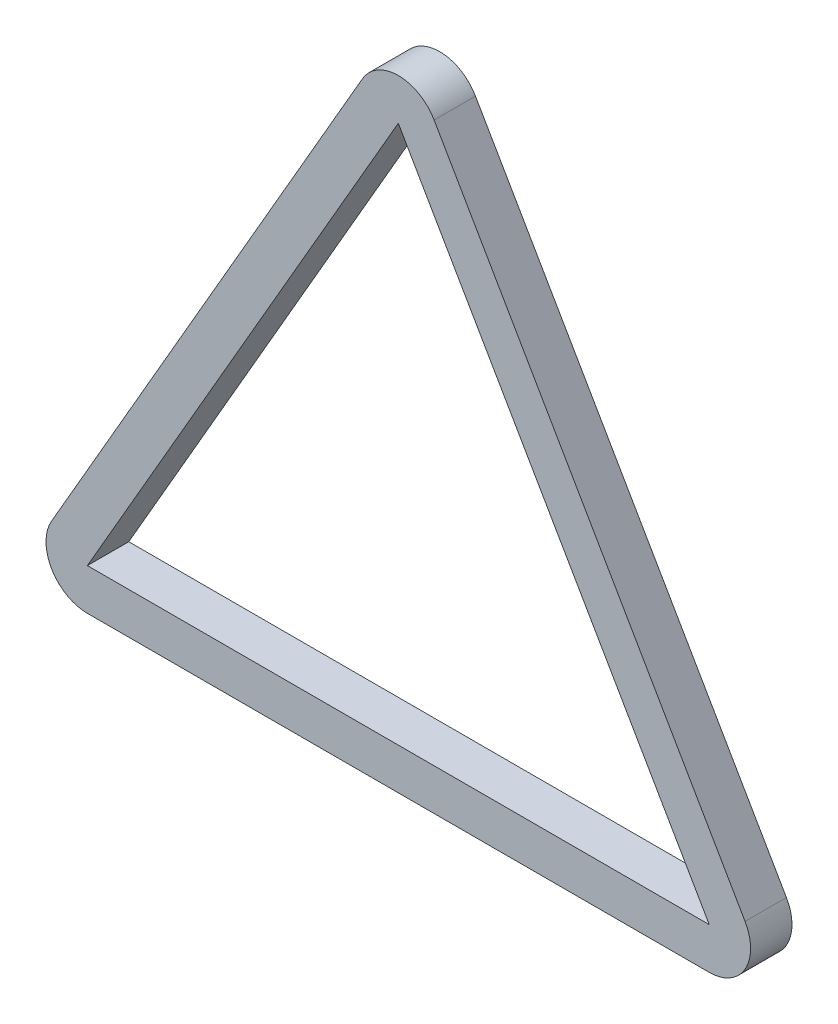
ISO-10303-21;
HEADER;
FILE_DESCRIPTION(('STEP AP214'),'2;1');
FILE_NAME('part.step','',(''),(''),'','','');
FILE_SCHEMA(('AUTOMOTIVE_DESIGN { 1 0 10303 214 1 1 1 1 }'));
ENDSEC;
DATA;
#1=APPLICATION_CONTEXT('core data for automotive mechanical design processes');
#2=APPLICATION_PROTOCOL_DEFINITION('international standard','automotive_design',2000,#1);
#3=PRODUCT_CONTEXT('',#1,'mechanical');
#4=PRODUCT('Part','Part','',(#3));
#5=PRODUCT_RELATED_PRODUCT_CATEGORY('part','',(#4));
#6=PRODUCT_DEFINITION_FORMATION('','',#4);
#7=PRODUCT_DEFINITION_CONTEXT('part definition',#1,'design');
#8=PRODUCT_DEFINITION('design','',#6,#7);
#9=PRODUCT_DEFINITION_SHAPE('','',#8);
#10=(LENGTH_UNIT() NAMED_UNIT(*) SI_UNIT(.MILLI.,.METRE.));
#11=(NAMED_UNIT(*) PLANE_ANGLE_UNIT() SI_UNIT($,.RADIAN.));
#12=(NAMED_UNIT(*) SI_UNIT($,.STERADIAN.) SOLID_ANGLE_UNIT());
#13=UNCERTAINTY_MEASURE_WITH_UNIT(LENGTH_MEASURE(1.E-05),#10,'distance_accuracy_value','');
#14=(GEOMETRIC_REPRESENTATION_CONTEXT(3) GLOBAL_UNCERTAINTY_ASSIGNED_CONTEXT((#13)) GLOBAL_UNIT_ASSIGNED_CONTEXT((#10,
#11,#12)) REPRESENTATION_CONTEXT('',''));
#15=CARTESIAN_POINT('',(0.,0.,0.));
#16=DIRECTION('',(0.,0.,1.));
#17=DIRECTION('',(1.,0.,0.));
#18=AXIS2_PLACEMENT_3D('',#15,#16,#17);
#19=CARTESIAN_POINT('',(0.,0.,20.));
#20=DIRECTION('',(0.,0.,1.));
#21=DIRECTION('',(1.,0.,0.));
#22=AXIS2_PLACEMENT_3D('',#19,#20,#21);
#23=PLANE('',#22);
#24=DIRECTION('',(-0.5,0.866025403784439,0.));
#25=VECTOR('',#24,1.);
#26=CARTESIAN_POINT('',(185.,-140.94634004319,20.));
#27=LINE('',#26,#25);
#28=CARTESIAN_POINT('',(167.679491924311,-110.94634004319,20.));
#29=VERTEX_POINT('',#28);
#30=CARTESIAN_POINT('',(17.3205080756889,149.483059357053,20.));
#31=VERTEX_POINT('',#30);
#32=EDGE_CURVE('E136',#29,#31,#27,.T.);
#33=ORIENTED_EDGE('',*,*,#32,.T.);
#34=CARTESIAN_POINT('',(0.,139.483059357053,20.));
#35=DIRECTION('',(0.,0.,1.));
#36=DIRECTION('',(1.,0.,0.));
#37=AXIS2_PLACEMENT_3D('',#34,#35,#36);
#38=CIRCLE('',#37,20.);
#39=CARTESIAN_POINT('',(-17.3205080756887,149.483059357053,20.));
#40=VERTEX_POINT('',#39);
#41=EDGE_CURVE('E169',#31,#40,#38,.T.);
#42=ORIENTED_EDGE('',*,*,#41,.T.);
#43=DIRECTION('',(-0.5,-0.866025403784439,0.));
#44=VECTOR('',#43,1.);
#45=CARTESIAN_POINT('',(0.,179.483059357053,20.));
#46=LINE('',#45,#44);
#47=CARTESIAN_POINT('',(-167.679491924311,-110.946340043189,20.));
#48=VERTEX_POINT('',#47);
#49=EDGE_CURVE('E139',#40,#48,#46,.T.);
#50=ORIENTED_EDGE('',*,*,#49,.T.);
#51=CARTESIAN_POINT('',(-150.358983848622,-120.94634004319,20.));
#52=DIRECTION('',(0.,0.,1.));
#53=DIRECTION('',(1.,0.,0.));
#54=AXIS2_PLACEMENT_3D('',#51,#52,#53);
#55=CIRCLE('',#54,20.);
#56=CARTESIAN_POINT('',(-150.358983848622,-140.94634004319,20.));
#57=VERTEX_POINT('',#56);
#58=EDGE_CURVE('E52',#48,#57,#55,.T.);
#59=ORIENTED_EDGE('',*,*,#58,.T.);
#60=DIRECTION('',(1.,0.,0.));
#61=VECTOR('',#60,1.);
#62=CARTESIAN_POINT('',(-185.,-140.94634004319,20.));
#63=LINE('',#62,#61);
#64=CARTESIAN_POINT('',(150.358983848622,-140.94634004319,20.));
#65=VERTEX_POINT('',#64);
#66=EDGE_CURVE('E142',#57,#65,#63,.T.);
#67=ORIENTED_EDGE('',*,*,#66,.T.);
#68=CARTESIAN_POINT('',(150.358983848622,-120.94634004319,20.));
#69=DIRECTION('',(0.,0.,1.));
#70=DIRECTION('',(1.,0.,0.));
#71=AXIS2_PLACEMENT_3D('',#68,#69,#70);
#72=CIRCLE('',#71,20.);
#73=EDGE_CURVE('E167',#65,#29,#72,.T.);
#74=ORIENTED_EDGE('',*,*,#73,.T.);
#75=EDGE_LOOP('',(#33,#42,#50,#59,#67,#74));
#76=FACE_BOUND('',#75,.T.);
#77=DIRECTION('',(-0.5,-0.866025403784438,0.));
#78=VECTOR('',#77,1.);
#79=CARTESIAN_POINT('',(0.,139.483059357053,20.));
#80=LINE('',#79,#78);
#81=CARTESIAN_POINT('',(0.,139.483059357053,20.));
#82=VERTEX_POINT('',#81);
#83=CARTESIAN_POINT('',(-150.358983848622,-120.94634004319,20.));
#84=VERTEX_POINT('',#83);
#85=EDGE_CURVE('E114',#82,#84,#80,.T.);
#86=ORIENTED_EDGE('',*,*,#85,.F.);
#87=DIRECTION('',(-0.5,0.866025403784438,0.));
#88=VECTOR('',#87,1.);
#89=CARTESIAN_POINT('',(150.358983848622,-120.94634004319,20.));
#90=LINE('',#89,#88);
#91=CARTESIAN_POINT('',(150.358983848622,-120.94634004319,20.));
#92=VERTEX_POINT('',#91);
#93=EDGE_CURVE('E104',#92,#82,#90,.T.);
#94=ORIENTED_EDGE('',*,*,#93,.F.);
#95=DIRECTION('',(1.,0.,0.));
#96=VECTOR('',#95,1.);
#97=CARTESIAN_POINT('',(-150.358983848622,-120.94634004319,20.));
#98=LINE('',#97,#96);
#99=EDGE_CURVE('E125',#84,#92,#98,.T.);
#100=ORIENTED_EDGE('',*,*,#99,.F.);
#101=EDGE_LOOP('',(#86,#94,#100));
#102=FACE_BOUND('',#101,.T.);
#103=ADVANCED_FACE('F32',(#76,#102),#23,.T.);
#104=CARTESIAN_POINT('',(0.,0.,0.));
#105=DIRECTION('',(0.,0.,1.));
#106=DIRECTION('',(1.,0.,0.));
#107=AXIS2_PLACEMENT_3D('',#104,#105,#106);
#108=PLANE('',#107);
#109=DIRECTION('',(-0.5,-0.866025403784439,0.));
#110=VECTOR('',#109,1.);
#111=CARTESIAN_POINT('',(0.,179.483059357053,0.));
#112=LINE('',#111,#110);
#113=CARTESIAN_POINT('',(-17.3205080756887,149.483059357053,0.));
#114=VERTEX_POINT('',#113);
#115=CARTESIAN_POINT('',(-167.679491924311,-110.946340043189,0.));
#116=VERTEX_POINT('',#115);
#117=EDGE_CURVE('E147',#114,#116,#112,.T.);
#118=ORIENTED_EDGE('',*,*,#117,.F.);
#119=CARTESIAN_POINT('',(0.,139.483059357053,0.));
#120=DIRECTION('',(0.,0.,1.));
#121=DIRECTION('',(1.,0.,0.));
#122=AXIS2_PLACEMENT_3D('',#119,#120,#121);
#123=CIRCLE('',#122,20.);
#124=CARTESIAN_POINT('',(17.3205080756889,149.483059357053,0.));
#125=VERTEX_POINT('',#124);
#126=EDGE_CURVE('E159',#114,#125,#123,.F.);
#127=ORIENTED_EDGE('',*,*,#126,.T.);
#128=DIRECTION('',(-0.5,0.866025403784439,0.));
#129=VECTOR('',#128,1.);
#130=CARTESIAN_POINT('',(185.,-140.94634004319,0.));
#131=LINE('',#130,#129);
#132=CARTESIAN_POINT('',(167.679491924311,-110.94634004319,0.));
#133=VERTEX_POINT('',#132);
#134=EDGE_CURVE('E122',#133,#125,#131,.T.);
#135=ORIENTED_EDGE('',*,*,#134,.F.);
#136=CARTESIAN_POINT('',(150.358983848622,-120.94634004319,0.));
#137=DIRECTION('',(0.,0.,1.));
#138=DIRECTION('',(1.,0.,0.));
#139=AXIS2_PLACEMENT_3D('',#136,#137,#138);
#140=CIRCLE('',#139,20.);
#141=CARTESIAN_POINT('',(150.358983848622,-140.94634004319,0.));
#142=VERTEX_POINT('',#141);
#143=EDGE_CURVE('E157',#133,#142,#140,.F.);
#144=ORIENTED_EDGE('',*,*,#143,.T.);
#145=DIRECTION('',(1.,0.,0.));
#146=VECTOR('',#145,1.);
#147=CARTESIAN_POINT('',(-185.,-140.94634004319,0.));
#148=LINE('',#147,#146);
#149=CARTESIAN_POINT('',(-150.358983848622,-140.94634004319,0.));
#150=VERTEX_POINT('',#149);
#151=EDGE_CURVE('E140',#150,#142,#148,.T.);
#152=ORIENTED_EDGE('',*,*,#151,.F.);
#153=CARTESIAN_POINT('',(-150.358983848622,-120.94634004319,0.));
#154=DIRECTION('',(0.,0.,1.));
#155=DIRECTION('',(1.,0.,0.));
#156=AXIS2_PLACEMENT_3D('',#153,#154,#155);
#157=CIRCLE('',#156,20.);
#158=EDGE_CURVE('E155',#150,#116,#157,.F.);
#159=ORIENTED_EDGE('',*,*,#158,.T.);
#160=EDGE_LOOP('',(#118,#127,#135,#144,#152,#159));
#161=FACE_BOUND('',#160,.T.);
#162=DIRECTION('',(-0.5,0.866025403784438,0.));
#163=VECTOR('',#162,1.);
#164=CARTESIAN_POINT('',(150.358983848622,-120.94634004319,0.));
#165=LINE('',#164,#163);
#166=CARTESIAN_POINT('',(150.358983848622,-120.94634004319,0.));
#167=VERTEX_POINT('',#166);
#168=CARTESIAN_POINT('',(0.,139.483059357053,0.));
#169=VERTEX_POINT('',#168);
#170=EDGE_CURVE('E129',#167,#169,#165,.T.);
#171=ORIENTED_EDGE('',*,*,#170,.T.);
#172=DIRECTION('',(-0.5,-0.866025403784438,0.));
#173=VECTOR('',#172,1.);
#174=CARTESIAN_POINT('',(0.,139.483059357053,0.));
#175=LINE('',#174,#173);
#176=CARTESIAN_POINT('',(-150.358983848622,-120.94634004319,0.));
#177=VERTEX_POINT('',#176);
#178=EDGE_CURVE('E121',#169,#177,#175,.T.);
#179=ORIENTED_EDGE('',*,*,#178,.T.);
#180=DIRECTION('',(1.,0.,0.));
#181=VECTOR('',#180,1.);
#182=CARTESIAN_POINT('',(-150.358983848622,-120.94634004319,0.));
#183=LINE('',#182,#181);
#184=EDGE_CURVE('E115',#177,#167,#183,.T.);
#185=ORIENTED_EDGE('',*,*,#184,.T.);
#186=EDGE_LOOP('',(#171,#179,#185));
#187=FACE_BOUND('',#186,.T.);
#188=ADVANCED_FACE('F177',(#161,#187),#108,.F.);
#189=CARTESIAN_POINT('',(185.,-140.94634004319,20.));
#190=DIRECTION('',(-0.866025403784439,-0.5,0.));
#191=DIRECTION('',(0.5,-0.866025403784439,0.));
#192=AXIS2_PLACEMENT_3D('',#189,#190,#191);
#193=PLANE('',#192);
#194=ORIENTED_EDGE('',*,*,#134,.T.);
#195=DIRECTION('',(0.,0.,-1.));
#196=VECTOR('',#195,1.);
#197=CARTESIAN_POINT('',(17.3205080756888,149.483059357053,20.));
#198=LINE('',#197,#196);
#199=EDGE_CURVE('E164',#125,#31,#198,.F.);
#200=ORIENTED_EDGE('',*,*,#199,.T.);
#201=ORIENTED_EDGE('',*,*,#32,.F.);
#202=DIRECTION('',(0.,0.,-1.));
#203=VECTOR('',#202,1.);
#204=CARTESIAN_POINT('',(167.679491924311,-110.94634004319,20.));
#205=LINE('',#204,#203);
#206=EDGE_CURVE('E161',#29,#133,#205,.T.);
#207=ORIENTED_EDGE('',*,*,#206,.T.);
#208=EDGE_LOOP('',(#194,#200,#201,#207));
#209=FACE_BOUND('',#208,.T.);
#210=ADVANCED_FACE('F186',(#209),#193,.F.);
#211=CARTESIAN_POINT('',(0.,179.483059357053,20.));
#212=DIRECTION('',(0.866025403784439,-0.5,0.));
#213=DIRECTION('',(0.5,0.866025403784439,0.));
#214=AXIS2_PLACEMENT_3D('',#211,#212,#213);
#215=PLANE('',#214);
#216=ORIENTED_EDGE('',*,*,#49,.F.);
#217=DIRECTION('',(0.,0.,-1.));
#218=VECTOR('',#217,1.);
#219=CARTESIAN_POINT('',(-17.3205080756887,149.483059357053,20.));
#220=LINE('',#219,#218);
#221=EDGE_CURVE('E152',#40,#114,#220,.T.);
#222=ORIENTED_EDGE('',*,*,#221,.T.);
#223=ORIENTED_EDGE('',*,*,#117,.T.);
#224=DIRECTION('',(0.,0.,-1.));
#225=VECTOR('',#224,1.);
#226=CARTESIAN_POINT('',(-167.679491924311,-110.94634004319,20.));
#227=LINE('',#226,#225);
#228=EDGE_CURVE('E144',#116,#48,#227,.F.);
#229=ORIENTED_EDGE('',*,*,#228,.T.);
#230=EDGE_LOOP('',(#216,#222,#223,#229));
#231=FACE_BOUND('',#230,.T.);
#232=ADVANCED_FACE('F194',(#231),#215,.F.);
#233=CARTESIAN_POINT('',(-185.,-140.94634004319,20.));
#234=DIRECTION('',(0.,1.,0.));
#235=DIRECTION('',(0.,0.,1.));
#236=AXIS2_PLACEMENT_3D('',#233,#234,#235);
#237=PLANE('',#236);
#238=ORIENTED_EDGE('',*,*,#151,.T.);
#239=DIRECTION('',(0.,0.,-1.));
#240=VECTOR('',#239,1.);
#241=CARTESIAN_POINT('',(150.358983848622,-140.94634004319,20.));
#242=LINE('',#241,#240);
#243=EDGE_CURVE('E11',#142,#65,#242,.F.);
#244=ORIENTED_EDGE('',*,*,#243,.T.);
#245=ORIENTED_EDGE('',*,*,#66,.F.);
#246=DIRECTION('',(0.,0.,-1.));
#247=VECTOR('',#246,1.);
#248=CARTESIAN_POINT('',(-150.358983848622,-140.94634004319,20.));
#249=LINE('',#248,#247);
#250=EDGE_CURVE('E40',#57,#150,#249,.T.);
#251=ORIENTED_EDGE('',*,*,#250,.T.);
#252=EDGE_LOOP('',(#238,#244,#245,#251));
#253=FACE_BOUND('',#252,.T.);
#254=ADVANCED_FACE('F173',(#253),#237,.F.);
#255=CARTESIAN_POINT('',(150.358983848622,-120.94634004319,20.));
#256=DIRECTION('',(-0.866025403784439,-0.5,0.));
#257=DIRECTION('',(0.5,-0.866025403784439,0.));
#258=AXIS2_PLACEMENT_3D('',#255,#256,#257);
#259=PLANE('',#258);
#260=ORIENTED_EDGE('',*,*,#170,.F.);
#261=DIRECTION('',(0.,0.,-1.));
#262=VECTOR('',#261,1.);
#263=CARTESIAN_POINT('',(150.358983848622,-120.94634004319,20.));
#264=LINE('',#263,#262);
#265=EDGE_CURVE('E110',#92,#167,#264,.T.);
#266=ORIENTED_EDGE('',*,*,#265,.F.);
#267=ORIENTED_EDGE('',*,*,#93,.T.);
#268=DIRECTION('',(0.,0.,-1.));
#269=VECTOR('',#268,1.);
#270=CARTESIAN_POINT('',(0.,139.483059357053,20.));
#271=LINE('',#270,#269);
#272=EDGE_CURVE('E107',#82,#169,#271,.T.);
#273=ORIENTED_EDGE('',*,*,#272,.T.);
#274=EDGE_LOOP('',(#260,#266,#267,#273));
#275=FACE_BOUND('',#274,.T.);
#276=ADVANCED_FACE('F106',(#275),#259,.T.);
#277=CARTESIAN_POINT('',(0.,139.483059357053,20.));
#278=DIRECTION('',(0.866025403784439,-0.5,0.));
#279=DIRECTION('',(0.5,0.866025403784439,0.));
#280=AXIS2_PLACEMENT_3D('',#277,#278,#279);
#281=PLANE('',#280);
#282=ORIENTED_EDGE('',*,*,#178,.F.);
#283=ORIENTED_EDGE('',*,*,#272,.F.);
#284=ORIENTED_EDGE('',*,*,#85,.T.);
#285=DIRECTION('',(0.,0.,-1.));
#286=VECTOR('',#285,1.);
#287=CARTESIAN_POINT('',(-150.358983848622,-120.94634004319,20.));
#288=LINE('',#287,#286);
#289=EDGE_CURVE('E123',#84,#177,#288,.T.);
#290=ORIENTED_EDGE('',*,*,#289,.T.);
#291=EDGE_LOOP('',(#282,#283,#284,#290));
#292=FACE_BOUND('',#291,.T.);
#293=ADVANCED_FACE('F119',(#292),#281,.T.);
#294=CARTESIAN_POINT('',(-150.358983848622,-120.94634004319,20.));
#295=DIRECTION('',(0.,1.,0.));
#296=DIRECTION('',(0.,0.,1.));
#297=AXIS2_PLACEMENT_3D('',#294,#295,#296);
#298=PLANE('',#297);
#299=ORIENTED_EDGE('',*,*,#184,.F.);
#300=ORIENTED_EDGE('',*,*,#289,.F.);
#301=ORIENTED_EDGE('',*,*,#99,.T.);
#302=ORIENTED_EDGE('',*,*,#265,.T.);
#303=EDGE_LOOP('',(#299,#300,#301,#302));
#304=FACE_BOUND('',#303,.T.);
#305=ADVANCED_FACE('F217',(#304),#298,.T.);
#306=CARTESIAN_POINT('',(0.,139.483059357053,20.));
#307=DIRECTION('',(0.,0.,-1.));
#308=DIRECTION('',(-1.,0.,0.));
#309=AXIS2_PLACEMENT_3D('',#306,#307,#308);
#310=CYLINDRICAL_SURFACE('',#309,20.);
#311=ORIENTED_EDGE('',*,*,#41,.F.);
#312=ORIENTED_EDGE('',*,*,#199,.F.);
#313=ORIENTED_EDGE('',*,*,#126,.F.);
#314=ORIENTED_EDGE('',*,*,#221,.F.);
#315=EDGE_LOOP('',(#311,#312,#313,#314));
#316=FACE_BOUND('',#315,.T.);
#317=ADVANCED_FACE('F192',(#316),#310,.T.);
#318=CARTESIAN_POINT('',(150.358983848622,-120.94634004319,20.));
#319=DIRECTION('',(0.,0.,-1.));
#320=DIRECTION('',(-1.,0.,0.));
#321=AXIS2_PLACEMENT_3D('',#318,#319,#320);
#322=CYLINDRICAL_SURFACE('',#321,20.);
#323=ORIENTED_EDGE('',*,*,#73,.F.);
#324=ORIENTED_EDGE('',*,*,#243,.F.);
#325=ORIENTED_EDGE('',*,*,#143,.F.);
#326=ORIENTED_EDGE('',*,*,#206,.F.);
#327=EDGE_LOOP('',(#323,#324,#325,#326));
#328=FACE_BOUND('',#327,.T.);
#329=ADVANCED_FACE('F183',(#328),#322,.T.);
#330=CARTESIAN_POINT('',(-150.358983848622,-120.94634004319,20.));
#331=DIRECTION('',(0.,0.,-1.));
#332=DIRECTION('',(-1.,0.,0.));
#333=AXIS2_PLACEMENT_3D('',#330,#331,#332);
#334=CYLINDRICAL_SURFACE('',#333,20.);
#335=ORIENTED_EDGE('',*,*,#58,.F.);
#336=ORIENTED_EDGE('',*,*,#228,.F.);
#337=ORIENTED_EDGE('',*,*,#158,.F.);
#338=ORIENTED_EDGE('',*,*,#250,.F.);
#339=EDGE_LOOP('',(#335,#336,#337,#338));
#340=FACE_BOUND('',#339,.T.);
#341=ADVANCED_FACE('F34',(#340),#334,.T.);
#342=CLOSED_SHELL('',(#103,#188,#210,#232,#254,#276,#293,#305,#317,#329,#341));
#343=MANIFOLD_SOLID_BREP('B2',#342);
#344=ADVANCED_BREP_SHAPE_REPRESENTATION('',(#18,#343),#14);
#345=SHAPE_DEFINITION_REPRESENTATION(#9,#344);
ENDSEC;
END-ISO-10303-21;
